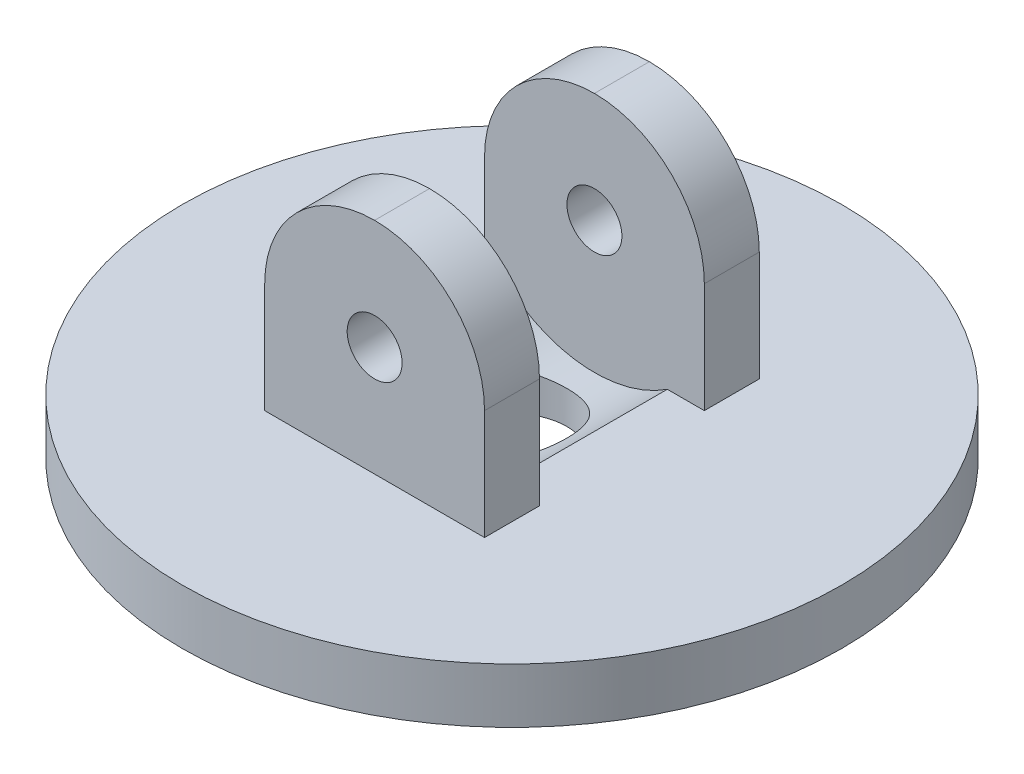
ISO-10303-21;
HEADER;
FILE_DESCRIPTION(('STEP AP214'),'2;1');
FILE_NAME('part.step','',(''),(''),'','','');
FILE_SCHEMA(('AUTOMOTIVE_DESIGN { 1 0 10303 214 1 1 1 1 }'));
ENDSEC;
DATA;
#1=APPLICATION_CONTEXT('core data for automotive mechanical design processes');
#2=APPLICATION_PROTOCOL_DEFINITION('international standard','automotive_design',2000,#1);
#3=PRODUCT_CONTEXT('',#1,'mechanical');
#4=PRODUCT('Part','Part','',(#3));
#5=PRODUCT_RELATED_PRODUCT_CATEGORY('part','',(#4));
#6=PRODUCT_DEFINITION_FORMATION('','',#4);
#7=PRODUCT_DEFINITION_CONTEXT('part definition',#1,'design');
#8=PRODUCT_DEFINITION('design','',#6,#7);
#9=PRODUCT_DEFINITION_SHAPE('','',#8);
#10=(LENGTH_UNIT() NAMED_UNIT(*) SI_UNIT(.MILLI.,.METRE.));
#11=(NAMED_UNIT(*) PLANE_ANGLE_UNIT() SI_UNIT($,.RADIAN.));
#12=(NAMED_UNIT(*) SI_UNIT($,.STERADIAN.) SOLID_ANGLE_UNIT());
#13=UNCERTAINTY_MEASURE_WITH_UNIT(LENGTH_MEASURE(1.E-05),#10,'distance_accuracy_value','');
#14=(GEOMETRIC_REPRESENTATION_CONTEXT(3) GLOBAL_UNCERTAINTY_ASSIGNED_CONTEXT((#13)) GLOBAL_UNIT_ASSIGNED_CONTEXT((#10,
#11,#12)) REPRESENTATION_CONTEXT('',''));
#15=CARTESIAN_POINT('',(0.,0.,0.));
#16=DIRECTION('',(0.,0.,1.));
#17=DIRECTION('',(1.,0.,0.));
#18=AXIS2_PLACEMENT_3D('',#15,#16,#17);
#19=CARTESIAN_POINT('',(0.,10.,0.));
#20=DIRECTION('',(0.,1.,0.));
#21=DIRECTION('',(0.,0.,1.));
#22=AXIS2_PLACEMENT_3D('',#19,#20,#21);
#23=PLANE('',#22);
#24=CARTESIAN_POINT('',(0.,10.,0.));
#25=DIRECTION('',(0.,1.,0.));
#26=DIRECTION('',(0.,0.,1.));
#27=AXIS2_PLACEMENT_3D('',#24,#25,#26);
#28=CIRCLE('',#27,60.);
#29=CARTESIAN_POINT('',(0.,10.,60.));
#30=VERTEX_POINT('',#29);
#31=EDGE_CURVE('E191',#30,#30,#28,.T.);
#32=ORIENTED_EDGE('',*,*,#31,.T.);
#33=EDGE_LOOP('',(#32));
#34=FACE_BOUND('',#33,.T.);
#35=DIRECTION('',(-1.,0.,0.));
#36=VECTOR('',#35,1.);
#37=CARTESIAN_POINT('',(-20.,10.,15.));
#38=LINE('',#37,#36);
#39=CARTESIAN_POINT('',(-13.2664991614216,10.,15.));
#40=VERTEX_POINT('',#39);
#41=CARTESIAN_POINT('',(-20.,10.,15.));
#42=VERTEX_POINT('',#41);
#43=EDGE_CURVE('E275',#40,#42,#38,.T.);
#44=ORIENTED_EDGE('',*,*,#43,.F.);
#45=DIRECTION('',(0.,0.,1.));
#46=VECTOR('',#45,1.);
#47=CARTESIAN_POINT('',(-13.2664991614216,10.,-15.));
#48=LINE('',#47,#46);
#49=CARTESIAN_POINT('',(-13.2664991614216,10.,-15.));
#50=VERTEX_POINT('',#49);
#51=EDGE_CURVE('E144',#40,#50,#48,.F.);
#52=ORIENTED_EDGE('',*,*,#51,.T.);
#53=DIRECTION('',(1.,0.,0.));
#54=VECTOR('',#53,1.);
#55=CARTESIAN_POINT('',(-20.,10.,-15.));
#56=LINE('',#55,#54);
#57=CARTESIAN_POINT('',(-20.,10.,-15.));
#58=VERTEX_POINT('',#57);
#59=EDGE_CURVE('E155',#58,#50,#56,.T.);
#60=ORIENTED_EDGE('',*,*,#59,.F.);
#61=DIRECTION('',(0.,0.,1.));
#62=VECTOR('',#61,1.);
#63=CARTESIAN_POINT('',(-20.,10.,-25.));
#64=LINE('',#63,#62);
#65=CARTESIAN_POINT('',(-20.,10.,-25.));
#66=VERTEX_POINT('',#65);
#67=EDGE_CURVE('E163',#66,#58,#64,.T.);
#68=ORIENTED_EDGE('',*,*,#67,.F.);
#69=DIRECTION('',(-1.,0.,0.));
#70=VECTOR('',#69,1.);
#71=CARTESIAN_POINT('',(-20.,10.,-25.));
#72=LINE('',#71,#70);
#73=CARTESIAN_POINT('',(20.,10.,-25.));
#74=VERTEX_POINT('',#73);
#75=EDGE_CURVE('E174',#74,#66,#72,.T.);
#76=ORIENTED_EDGE('',*,*,#75,.F.);
#77=DIRECTION('',(0.,0.,-1.));
#78=VECTOR('',#77,1.);
#79=CARTESIAN_POINT('',(20.,10.,-25.));
#80=LINE('',#79,#78);
#81=CARTESIAN_POINT('',(20.,10.,-15.));
#82=VERTEX_POINT('',#81);
#83=EDGE_CURVE('E161',#82,#74,#80,.T.);
#84=ORIENTED_EDGE('',*,*,#83,.F.);
#85=CARTESIAN_POINT('',(13.2664991614216,10.,-15.));
#86=VERTEX_POINT('',#85);
#87=EDGE_CURVE('E152',#86,#82,#56,.T.);
#88=ORIENTED_EDGE('',*,*,#87,.F.);
#89=DIRECTION('',(0.,0.,1.));
#90=VECTOR('',#89,1.);
#91=CARTESIAN_POINT('',(13.2664991614216,10.,-15.));
#92=LINE('',#91,#90);
#93=CARTESIAN_POINT('',(13.2664991614216,10.,15.));
#94=VERTEX_POINT('',#93);
#95=EDGE_CURVE('E134',#86,#94,#92,.T.);
#96=ORIENTED_EDGE('',*,*,#95,.T.);
#97=CARTESIAN_POINT('',(20.,10.,15.));
#98=VERTEX_POINT('',#97);
#99=EDGE_CURVE('E276',#98,#94,#38,.T.);
#100=ORIENTED_EDGE('',*,*,#99,.F.);
#101=DIRECTION('',(0.,0.,-1.));
#102=VECTOR('',#101,1.);
#103=CARTESIAN_POINT('',(20.,10.,25.));
#104=LINE('',#103,#102);
#105=CARTESIAN_POINT('',(20.,10.,25.));
#106=VERTEX_POINT('',#105);
#107=EDGE_CURVE('E271',#106,#98,#104,.T.);
#108=ORIENTED_EDGE('',*,*,#107,.F.);
#109=DIRECTION('',(1.,0.,0.));
#110=VECTOR('',#109,1.);
#111=CARTESIAN_POINT('',(-20.,10.,25.));
#112=LINE('',#111,#110);
#113=CARTESIAN_POINT('',(-20.,10.,25.));
#114=VERTEX_POINT('',#113);
#115=EDGE_CURVE('E267',#114,#106,#112,.T.);
#116=ORIENTED_EDGE('',*,*,#115,.F.);
#117=DIRECTION('',(0.,0.,1.));
#118=VECTOR('',#117,1.);
#119=CARTESIAN_POINT('',(-20.,10.,25.));
#120=LINE('',#119,#118);
#121=EDGE_CURVE('E235',#42,#114,#120,.T.);
#122=ORIENTED_EDGE('',*,*,#121,.F.);
#123=EDGE_LOOP('',(#44,#52,#60,#68,#76,#84,#88,#96,#100,#108,#116,#122));
#124=FACE_BOUND('',#123,.T.);
#125=ADVANCED_FACE('F38',(#34,#124),#23,.T.);
#126=CARTESIAN_POINT('',(0.,0.,0.));
#127=DIRECTION('',(0.,1.,0.));
#128=DIRECTION('',(0.,0.,1.));
#129=AXIS2_PLACEMENT_3D('',#126,#127,#128);
#130=CYLINDRICAL_SURFACE('',#129,10.);
#131=CARTESIAN_POINT('',(0.,0.,0.));
#132=DIRECTION('',(0.,1.,0.));
#133=DIRECTION('',(0.,0.,1.));
#134=AXIS2_PLACEMENT_3D('',#131,#132,#133);
#135=CIRCLE('',#134,10.);
#136=CARTESIAN_POINT('',(0.,0.,10.));
#137=VERTEX_POINT('',#136);
#138=EDGE_CURVE('E252',#137,#137,#135,.T.);
#139=ORIENTED_EDGE('',*,*,#138,.F.);
#140=EDGE_LOOP('',(#139));
#141=FACE_BOUND('',#140,.T.);
#142=CARTESIAN_POINT('',(0.,6.,10.));
#143=CARTESIAN_POINT('',(-0.267942395980707,6.00000145108515,9.9999981895495));
#144=CARTESIAN_POINT('',(-0.535975386790484,6.00449934053446,9.98921643496793));
#145=CARTESIAN_POINT('',(-1.07013305673722,6.02237885410001,9.94618964916572));
#146=CARTESIAN_POINT('',(-1.33625642052598,6.03576609977471,9.91393103611578));
#147=CARTESIAN_POINT('',(-1.8651015883341,6.07111010004662,9.82818909355407));
#148=CARTESIAN_POINT('',(-2.12781449972209,6.09308586792827,9.77465866802495));
#149=CARTESIAN_POINT('',(-2.64736249392761,6.14502886062445,9.64691914329621));
#150=CARTESIAN_POINT('',(-2.90419716793913,6.17499663942615,9.5727086105848));
#151=CARTESIAN_POINT('',(-3.40937126539884,6.24203524803507,9.4046161350003));
#152=CARTESIAN_POINT('',(-3.65773720147229,6.27908093139522,9.31080372656805));
#153=CARTESIAN_POINT('',(-4.14537925200735,6.35942232689406,9.10417315678626));
#154=CARTESIAN_POINT('',(-4.3846550422233,6.4027182617154,8.99135431825563));
#155=CARTESIAN_POINT('',(-4.85262077490821,6.49449269620126,8.74766300293879));
#156=CARTESIAN_POINT('',(-5.08131661556162,6.54296825715981,8.61680075112822));
#157=CARTESIAN_POINT('',(-5.52707949283141,6.64397873321707,8.33790160730945));
#158=CARTESIAN_POINT('',(-5.74414222952782,6.69651513202878,8.18985842788523));
#159=CARTESIAN_POINT('',(-6.3953274108156,6.86331954433258,7.70714569006144));
#160=CARTESIAN_POINT('',(-6.80822010888224,6.98247041699852,7.3449076619119));
#161=CARTESIAN_POINT('',(-7.56938865772991,7.22141220681727,6.55776712751856));
#162=CARTESIAN_POINT('',(-7.91763048634872,7.34120342702988,6.13283183709327));
#163=CARTESIAN_POINT('',(-8.39284572548998,7.51465972253198,5.44455762954869));
#164=CARTESIAN_POINT('',(-8.5463720967626,7.57271662556289,5.20028667364792));
#165=CARTESIAN_POINT('',(-8.83215198012491,7.68371511118905,4.6985466404976));
#166=CARTESIAN_POINT('',(-8.96441428989846,7.73665880565816,4.44108307993226));
#167=CARTESIAN_POINT('',(-9.20650917204407,7.83567480660773,3.91460603226709));
#168=CARTESIAN_POINT('',(-9.31634570496792,7.88174832602173,3.64559459477848));
#169=CARTESIAN_POINT('',(-9.51251468153739,7.96540333382051,3.09784789030255));
#170=CARTESIAN_POINT('',(-9.59884887528677,8.0029854544826,2.81911334909174));
#171=CARTESIAN_POINT('',(-9.74345681562225,8.06666939227215,2.26767420509551));
#172=CARTESIAN_POINT('',(-9.80288112649533,8.09323670067077,1.99532507734976));
#173=CARTESIAN_POINT('',(-9.89885422881268,8.1364351763224,1.44584100266982));
#174=CARTESIAN_POINT('',(-9.93540372731637,8.15306665069087,1.16870620393261));
#175=CARTESIAN_POINT('',(-9.98516136195053,8.17576337963049,0.612048282328569));
#176=CARTESIAN_POINT('',(-9.99838055247046,8.18183363830786,0.33252635365589));
#177=CARTESIAN_POINT('',(-10.0013392571555,8.18318947893515,-0.226660695496647));
#178=CARTESIAN_POINT('',(-9.99108000725272,8.17847562857297,-0.506325807664353));
#179=CARTESIAN_POINT('',(-9.94891108808752,8.15922069502046,-1.04196824710988));
#180=CARTESIAN_POINT('',(-9.91872846038543,8.14546386293893,-1.29811212300439));
#181=CARTESIAN_POINT('',(-9.83878936523855,8.10935938132824,-1.80680162390708));
#182=CARTESIAN_POINT('',(-9.78902616581406,8.08700877724198,-2.05934598039078));
#183=CARTESIAN_POINT('',(-9.67044051170048,8.03441835818663,-2.55900400929334));
#184=CARTESIAN_POINT('',(-9.6016226225033,8.00418043311521,-2.80611896730348));
#185=CARTESIAN_POINT('',(-9.44552692475773,7.93669912481547,-3.29356087170525));
#186=CARTESIAN_POINT('',(-9.35824188156607,7.89945299670681,-3.53388511583638));
#187=CARTESIAN_POINT('',(-9.16394698471947,7.8181743928026,-4.01121580452416));
#188=CARTESIAN_POINT('',(-9.05656430537203,7.7740167734116,-4.24804900618901));
#189=CARTESIAN_POINT('',(-8.82410320535877,7.68070593067434,-4.71195821415097));
#190=CARTESIAN_POINT('',(-8.69901712705675,7.63155054814173,-4.93902994239889));
#191=CARTESIAN_POINT('',(-8.43201215607237,7.52953961118728,-5.38220233390738));
#192=CARTESIAN_POINT('',(-8.29009159360978,7.47668368992952,-5.59830190581994));
#193=CARTESIAN_POINT('',(-7.9902700492105,7.36858427917656,-6.01848873444992));
#194=CARTESIAN_POINT('',(-7.83236817124684,7.31334065590929,-6.22257531661739));
#195=CARTESIAN_POINT('',(-7.48739534707948,7.19704445100181,-6.63453641692557));
#196=CARTESIAN_POINT('',(-7.29898640936491,7.13589642953205,-6.84126541689093));
#197=CARTESIAN_POINT('',(-6.90552786336652,7.01400243334858,-7.2382151943001));
#198=CARTESIAN_POINT('',(-6.70048352580666,6.95325633783593,-7.42844116130652));
#199=CARTESIAN_POINT('',(-6.27470806402233,6.8337108333508,-7.79142753826167));
#200=CARTESIAN_POINT('',(-6.05396724572562,6.7749126608446,-7.96417699243239));
#201=CARTESIAN_POINT('',(-5.59823981484959,6.66087285386127,-8.29085517091424));
#202=CARTESIAN_POINT('',(-5.36325897233397,6.60562979731321,-8.44479144306204));
#203=CARTESIAN_POINT('',(-4.87467792752361,6.49890474260674,-8.73614831191795));
#204=CARTESIAN_POINT('',(-4.62077079368976,6.44754092273543,-8.8730984491202));
#205=CARTESIAN_POINT('',(-4.10101925722221,6.35150168964948,-9.1249675110769));
#206=CARTESIAN_POINT('',(-3.83517454901391,6.30682644777415,-9.23988587147105));
#207=CARTESIAN_POINT('',(-3.29355055555416,6.22548687441594,-9.44650699674161));
#208=CARTESIAN_POINT('',(-3.01777576481973,6.18881897047884,-9.53822011748832));
#209=CARTESIAN_POINT('',(-2.45830619661031,6.12457361867509,-9.69748954850472));
#210=CARTESIAN_POINT('',(-2.17461202248804,6.09699548032718,-9.76504769367972));
#211=CARTESIAN_POINT('',(-1.61977734325061,6.05320893538955,-9.87172771946447));
#212=CARTESIAN_POINT('',(-1.34897802133085,6.03639163134098,-9.91237815034425));
#213=CARTESIAN_POINT('',(-0.804548170756187,6.01194181846127,-9.97134194778859));
#214=CARTESIAN_POINT('',(-0.530917761770171,6.00430892299576,-9.98965625463332));
#215=CARTESIAN_POINT('',(0.0169540328602272,5.99844280911532,-10.0037386869103));
#216=CARTESIAN_POINT('',(0.291195249905776,6.00020725693902,-9.99951241013105));
#217=CARTESIAN_POINT('',(0.838181199281528,6.01308094868715,-9.96857485020084));
#218=CARTESIAN_POINT('',(1.11092596475505,6.02418998480042,-9.94186406707527));
#219=CARTESIAN_POINT('',(1.63930826360069,6.05466237165811,-9.86814339000837));
#220=CARTESIAN_POINT('',(1.89512214440097,6.07358787630445,-9.8222087479073));
#221=CARTESIAN_POINT('',(2.40173705740469,6.11912187419512,-9.71076340176822));
#222=CARTESIAN_POINT('',(2.65253829706156,6.14573004877714,-9.64525350966983));
#223=CARTESIAN_POINT('',(3.14750041507577,6.20597983538016,-9.4952676677369));
#224=CARTESIAN_POINT('',(3.39166194748983,6.23962075177087,-9.41079359364735));
#225=CARTESIAN_POINT('',(3.87199414315334,6.31315277271617,-9.22356446385607));
#226=CARTESIAN_POINT('',(4.10816170810727,6.35304626766267,-9.12080241452646));
#227=CARTESIAN_POINT('',(4.57820933295416,6.43946482552895,-8.89438615455572));
#228=CARTESIAN_POINT('',(4.81179717415901,6.48615573044866,-8.77018792249117));
#229=CARTESIAN_POINT('',(5.26774794175134,6.58408004333587,-8.50415056860546));
#230=CARTESIAN_POINT('',(5.49010668089235,6.63531512644823,-8.36230493350176));
#231=CARTESIAN_POINT('',(6.13851398375824,6.7940483788341,-7.91172862855906));
#232=CARTESIAN_POINT('',(6.54616415415541,6.90662640154452,-7.57782750277633));
#233=CARTESIAN_POINT('',(7.33078601774137,7.14306238755664,-6.82466022091744));
#234=CARTESIAN_POINT('',(7.70348322772502,7.26715150401836,-6.40099873603727));
#235=CARTESIAN_POINT('',(8.20590761804761,7.44573593924171,-5.72211770604184));
#236=CARTESIAN_POINT('',(8.36403173748506,7.50404211396568,-5.4884227862175));
#237=CARTESIAN_POINT('',(8.66033996875701,7.61644398446383,-5.00780358757204));
#238=CARTESIAN_POINT('',(8.79853255464516,7.67054146506587,-4.76088499249968));
#239=CARTESIAN_POINT('',(9.05579366385487,7.77361671552287,-4.25149834936423));
#240=CARTESIAN_POINT('',(9.1745487005692,7.8225068118078,-3.98885419029191));
#241=CARTESIAN_POINT('',(9.38926339825983,7.91255355903525,-3.45324768988092));
#242=CARTESIAN_POINT('',(9.48523354221353,7.95371376455242,-3.18029016083085));
#243=CARTESIAN_POINT('',(9.65337406208339,8.02681669120512,-2.6260597242477));
#244=CARTESIAN_POINT('',(9.72555515375209,8.05876356166482,-2.34479062303974));
#245=CARTESIAN_POINT('',(9.84529914152277,8.11223163366638,-1.77609061250737));
#246=CARTESIAN_POINT('',(9.89286435294321,8.13375381572052,-1.48866028534446));
#247=CARTESIAN_POINT('',(9.96006579137929,8.16428769763751,-0.932427459074371));
#248=CARTESIAN_POINT('',(9.98157087726664,8.17413525190282,-0.663895216263347));
#249=CARTESIAN_POINT('',(10.0028327321041,8.1838710678816,-0.125796102540515));
#250=CARTESIAN_POINT('',(10.0025906655847,8.18375986287309,0.143770712198395));
#251=CARTESIAN_POINT('',(9.98036393979872,8.17358296274773,0.681774706919221));
#252=CARTESIAN_POINT('',(9.95838230067602,8.1635186503543,0.950212038611109));
#253=CARTESIAN_POINT('',(9.89294109580396,8.13379310943618,1.48391191230305));
#254=CARTESIAN_POINT('',(9.84948170264495,8.11413195802953,1.74917447979723));
#255=CARTESIAN_POINT('',(9.74410734970007,8.06702189864409,2.26223732772079));
#256=CARTESIAN_POINT('',(9.68315249596811,8.03998103286627,2.51027346164222));
#257=CARTESIAN_POINT('',(9.54273065392196,7.97859769500439,3.00020901410215));
#258=CARTESIAN_POINT('',(9.46325727587218,7.94425270302159,3.24210628243214));
#259=CARTESIAN_POINT('',(9.28649146145427,7.86924571154372,3.71827605543357));
#260=CARTESIAN_POINT('',(9.18919912820776,7.82858374860634,3.95254860422144));
#261=CARTESIAN_POINT('',(8.97753078967763,7.74203493568434,4.41225408875043));
#262=CARTESIAN_POINT('',(8.86315322964287,7.69614761028352,4.63768621765613));
#263=CARTESIAN_POINT('',(8.61072104068825,7.59743473200432,5.09185372728644));
#264=CARTESIAN_POINT('',(8.47165658261052,7.54435794140144,5.31997344172964));
#265=CARTESIAN_POINT('',(8.1761289977619,7.43507747672431,5.76385420355818));
#266=CARTESIAN_POINT('',(8.0196653200727,7.37887370366736,5.97961485928588));
#267=CARTESIAN_POINT('',(7.69022066745612,7.26476530625256,6.39776298356835));
#268=CARTESIAN_POINT('',(7.51723470700089,7.20686017218889,6.60014638422541));
#269=CARTESIAN_POINT('',(7.15572827054764,7.09079680842715,6.990444385111));
#270=CARTESIAN_POINT('',(6.96720766946325,7.03263857669469,7.1783588688109));
#271=CARTESIAN_POINT('',(6.56125754755266,6.91325357537494,7.55191630127629));
#272=CARTESIAN_POINT('',(6.34272209778389,6.85211354484875,7.7363875582125));
#273=CARTESIAN_POINT('',(5.89021111727877,6.73285284569504,8.08623374688171));
#274=CARTESIAN_POINT('',(5.65624068426858,6.67473119140784,8.25161493437974));
#275=CARTESIAN_POINT('',(5.17400243577387,6.56304223520821,8.56224345669264));
#276=CARTESIAN_POINT('',(4.92572437862211,6.5094782654343,8.70747610892881));
#277=CARTESIAN_POINT('',(4.41660546861321,6.40845643334078,8.97643954986754));
#278=CARTESIAN_POINT('',(4.15576564545925,6.36099807170398,9.10017209714128));
#279=CARTESIAN_POINT('',(3.6276495269143,6.27426327218203,9.32314114293535));
#280=CARTESIAN_POINT('',(3.36054883777494,6.23486546260657,9.42274595115176));
#281=CARTESIAN_POINT('',(2.81782391356667,6.16442330159726,9.59902342369105));
#282=CARTESIAN_POINT('',(2.54220054934508,6.1333780998177,9.67569842249512));
#283=CARTESIAN_POINT('',(1.98530395148749,6.08062286825473,9.80510503882957));
#284=CARTESIAN_POINT('',(1.70404780879171,6.05888808223626,9.85790017369439));
#285=CARTESIAN_POINT('',(1.13760493417306,6.02530022866351,9.93919582049617));
#286=CARTESIAN_POINT('',(0.852421244127532,6.01343990762781,9.96771416577048));
#287=CARTESIAN_POINT('',(0.472221831071567,6.00446008105422,9.98929154209191));
#288=CARTESIAN_POINT('',(0.377833617506555,6.00278845391753,9.99330612551536));
#289=CARTESIAN_POINT('',(0.188967358271803,6.00055815593586,9.99866067752467));
#290=CARTESIAN_POINT('',(0.0944893123455943,5.99999948827793,10.0000006384515));
#291=CARTESIAN_POINT('',(0.,6.,10.));
#292=B_SPLINE_CURVE_WITH_KNOTS('',3,(#142,#143,#144,#145,#146,#147,#148,#149,#150,#151,#152,
#153,#154,#155,#156,#157,#158,#159,#160,#161,#162,#163,#164,#165,#166,#167,#168,#169,#170,#171,
#172,#173,#174,#175,#176,#177,#178,#179,#180,#181,#182,#183,#184,#185,#186,#187,#188,#189,#190,
#191,#192,#193,#194,#195,#196,#197,#198,#199,#200,#201,#202,#203,#204,#205,#206,#207,#208,#209,
#210,#211,#212,#213,#214,#215,#216,#217,#218,#219,#220,#221,#222,#223,#224,#225,#226,#227,#228,
#229,#230,#231,#232,#233,#234,#235,#236,#237,#238,#239,#240,#241,#242,#243,#244,#245,#246,#247,
#248,#249,#250,#251,#252,#253,#254,#255,#256,#257,#258,#259,#260,#261,#262,#263,#264,#265,#266,
#267,#268,#269,#270,#271,#272,#273,#274,#275,#276,#277,#278,#279,#280,#281,#282,#283,#284,#285,
#286,#287,#288,#289,#290,#291),.UNSPECIFIED.,.T.,.F.,(4,2,2,2,2,2,2,2,2,2,2,2,2,2,2,2,2,2,2,2,2,
2,2,2,2,2,2,2,2,2,2,2,2,2,2,2,2,2,2,2,2,2,2,2,2,2,2,2,2,2,2,2,2,2,2,2,2,2,2,2,2,2,2,2,2,2,2,2,2,
2,2,2,2,2,4),(0.,0.803731022385501,1.60797080258543,2.41400118839126,3.22008746083233,
4.0233613974063,4.82666395992459,5.62951315773824,6.4326570928182,8.11101650109896,
9.79025664851163,10.6722031871639,11.5537838894916,12.4352087634634,13.3165679840891,
14.1555070347902,14.9944201526421,15.8329356690324,16.671407046018,17.4453474505236,
18.2195541756497,18.9935755616024,19.7679007394577,20.5583469245758,21.349136069514,
22.1400037170031,22.9309157307841,23.7888750228648,24.6465635346903,25.5047864302448,
26.3626638690609,27.2406049103281,28.1185684377023,28.9961394598893,29.8736438042196,
30.6956359784825,31.5175935482797,32.3393470004546,33.161082178414,33.9419625125544,
34.7228104619393,35.5035812117474,36.2846511854851,37.0896723910966,37.8949915993317,
39.5047252151185,41.2294998199023,42.0930357391932,42.9562034300237,43.8321527240562,
44.7076982229509,45.5828487925781,46.4579170323973,47.2655905256518,48.0732207691145,
48.8807388292805,49.688250400521,50.4579274466525,51.2278704607628,51.9978090192098,
52.7678176845946,53.5841015604466,54.4004112899784,55.2169681203578,56.0335315263713,
56.9098269079493,57.7858343097063,58.6624767569353,59.5390474666284,60.4012486954102,
61.263362113679,62.123168739397,62.9823432186909,63.2657764315139,63.549210455973),.UNSPECIFIED.);
#293=CARTESIAN_POINT('',(0.,6.,10.));
#294=VERTEX_POINT('',#293);
#295=EDGE_CURVE('E42',#294,#294,#292,.T.);
#296=ORIENTED_EDGE('',*,*,#295,.F.);
#297=EDGE_LOOP('',(#296));
#298=FACE_BOUND('',#297,.T.);
#299=ADVANCED_FACE('F317',(#141,#298),#130,.F.);
#300=CARTESIAN_POINT('',(0.,10.,0.));
#301=DIRECTION('',(0.,-1.,0.));
#302=DIRECTION('',(0.,0.,-1.));
#303=AXIS2_PLACEMENT_3D('',#300,#301,#302);
#304=CYLINDRICAL_SURFACE('',#303,60.);
#305=ORIENTED_EDGE('',*,*,#31,.F.);
#306=EDGE_LOOP('',(#305));
#307=FACE_BOUND('',#306,.T.);
#308=CARTESIAN_POINT('',(0.,0.,0.));
#309=DIRECTION('',(0.,1.,0.));
#310=DIRECTION('',(0.,0.,1.));
#311=AXIS2_PLACEMENT_3D('',#308,#309,#310);
#312=CIRCLE('',#311,60.);
#313=CARTESIAN_POINT('',(0.,0.,60.));
#314=VERTEX_POINT('',#313);
#315=EDGE_CURVE('E190',#314,#314,#312,.T.);
#316=ORIENTED_EDGE('',*,*,#315,.T.);
#317=EDGE_LOOP('',(#316));
#318=FACE_BOUND('',#317,.T.);
#319=ADVANCED_FACE('F319',(#307,#318),#304,.T.);
#320=CARTESIAN_POINT('',(0.,0.,0.));
#321=DIRECTION('',(0.,1.,0.));
#322=DIRECTION('',(0.,0.,1.));
#323=AXIS2_PLACEMENT_3D('',#320,#321,#322);
#324=PLANE('',#323);
#325=ORIENTED_EDGE('',*,*,#138,.T.);
#326=EDGE_LOOP('',(#325));
#327=FACE_BOUND('',#326,.T.);
#328=ORIENTED_EDGE('',*,*,#315,.F.);
#329=EDGE_LOOP('',(#328));
#330=FACE_BOUND('',#329,.T.);
#331=ADVANCED_FACE('F326',(#327,#330),#324,.F.);
#332=CARTESIAN_POINT('',(-20.,50.,-25.));
#333=DIRECTION('',(1.,0.,0.));
#334=DIRECTION('',(0.,0.,-1.));
#335=AXIS2_PLACEMENT_3D('',#332,#333,#334);
#336=PLANE('',#335);
#337=DIRECTION('',(0.,-1.,0.));
#338=VECTOR('',#337,1.);
#339=CARTESIAN_POINT('',(-20.,50.,-15.));
#340=LINE('',#339,#338);
#341=CARTESIAN_POINT('',(-20.,30.,-15.));
#342=VERTEX_POINT('',#341);
#343=EDGE_CURVE('E187',#342,#58,#340,.T.);
#344=ORIENTED_EDGE('',*,*,#343,.F.);
#345=DIRECTION('',(0.,0.,1.));
#346=VECTOR('',#345,1.);
#347=CARTESIAN_POINT('',(-20.,30.,-25.));
#348=LINE('',#347,#346);
#349=CARTESIAN_POINT('',(-20.,30.,-25.));
#350=VERTEX_POINT('',#349);
#351=EDGE_CURVE('E11',#342,#350,#348,.F.);
#352=ORIENTED_EDGE('',*,*,#351,.T.);
#353=DIRECTION('',(0.,-1.,0.));
#354=VECTOR('',#353,1.);
#355=CARTESIAN_POINT('',(-20.,50.,-25.));
#356=LINE('',#355,#354);
#357=EDGE_CURVE('E178',#350,#66,#356,.T.);
#358=ORIENTED_EDGE('',*,*,#357,.T.);
#359=ORIENTED_EDGE('',*,*,#67,.T.);
#360=EDGE_LOOP('',(#344,#352,#358,#359));
#361=FACE_BOUND('',#360,.T.);
#362=ADVANCED_FACE('F359',(#361),#336,.F.);
#363=CARTESIAN_POINT('',(-20.,50.,-15.));
#364=DIRECTION('',(0.,0.,-1.));
#365=DIRECTION('',(-1.,0.,0.));
#366=AXIS2_PLACEMENT_3D('',#363,#364,#365);
#367=PLANE('',#366);
#368=ORIENTED_EDGE('',*,*,#87,.T.);
#369=DIRECTION('',(0.,-1.,0.));
#370=VECTOR('',#369,1.);
#371=CARTESIAN_POINT('',(20.,50.,-15.));
#372=LINE('',#371,#370);
#373=CARTESIAN_POINT('',(20.,30.,-15.));
#374=VERTEX_POINT('',#373);
#375=EDGE_CURVE('E184',#374,#82,#372,.T.);
#376=ORIENTED_EDGE('',*,*,#375,.F.);
#377=CARTESIAN_POINT('',(0.,30.,-15.));
#378=DIRECTION('',(0.,0.,-1.));
#379=DIRECTION('',(-1.,0.,0.));
#380=AXIS2_PLACEMENT_3D('',#377,#378,#379);
#381=CIRCLE('',#380,20.);
#382=CARTESIAN_POINT('',(0.,50.,-15.));
#383=VERTEX_POINT('',#382);
#384=EDGE_CURVE('E211',#374,#383,#381,.F.);
#385=ORIENTED_EDGE('',*,*,#384,.T.);
#386=CARTESIAN_POINT('',(0.,30.,-15.));
#387=DIRECTION('',(0.,0.,-1.));
#388=DIRECTION('',(-1.,0.,0.));
#389=AXIS2_PLACEMENT_3D('',#386,#387,#388);
#390=CIRCLE('',#389,20.);
#391=EDGE_CURVE('E208',#383,#342,#390,.F.);
#392=ORIENTED_EDGE('',*,*,#391,.T.);
#393=ORIENTED_EDGE('',*,*,#343,.T.);
#394=ORIENTED_EDGE('',*,*,#59,.T.);
#395=CARTESIAN_POINT('',(0.,30.,-15.));
#396=DIRECTION('',(0.,0.,-1.));
#397=DIRECTION('',(-1.,0.,0.));
#398=AXIS2_PLACEMENT_3D('',#395,#396,#397);
#399=CIRCLE('',#398,24.);
#400=EDGE_CURVE('E138',#86,#50,#399,.T.);
#401=ORIENTED_EDGE('',*,*,#400,.F.);
#402=EDGE_LOOP('',(#368,#376,#385,#392,#393,#394,#401));
#403=FACE_BOUND('',#402,.T.);
#404=CARTESIAN_POINT('',(0.,30.,-15.));
#405=DIRECTION('',(0.,0.,-1.));
#406=DIRECTION('',(-1.,0.,0.));
#407=AXIS2_PLACEMENT_3D('',#404,#405,#406);
#408=CIRCLE('',#407,5.);
#409=CARTESIAN_POINT('',(-5.,30.,-15.));
#410=VERTEX_POINT('',#409);
#411=EDGE_CURVE('E239',#410,#410,#408,.T.);
#412=ORIENTED_EDGE('',*,*,#411,.T.);
#413=EDGE_LOOP('',(#412));
#414=FACE_BOUND('',#413,.T.);
#415=ADVANCED_FACE('F149',(#403,#414),#367,.F.);
#416=CARTESIAN_POINT('',(20.,50.,-25.));
#417=DIRECTION('',(-1.,0.,0.));
#418=DIRECTION('',(0.,0.,1.));
#419=AXIS2_PLACEMENT_3D('',#416,#417,#418);
#420=PLANE('',#419);
#421=DIRECTION('',(0.,-1.,0.));
#422=VECTOR('',#421,1.);
#423=CARTESIAN_POINT('',(20.,50.,-25.));
#424=LINE('',#423,#422);
#425=CARTESIAN_POINT('',(20.,30.,-25.));
#426=VERTEX_POINT('',#425);
#427=EDGE_CURVE('E181',#426,#74,#424,.T.);
#428=ORIENTED_EDGE('',*,*,#427,.F.);
#429=DIRECTION('',(0.,0.,-1.));
#430=VECTOR('',#429,1.);
#431=CARTESIAN_POINT('',(20.,30.,-15.));
#432=LINE('',#431,#430);
#433=EDGE_CURVE('E204',#426,#374,#432,.F.);
#434=ORIENTED_EDGE('',*,*,#433,.T.);
#435=ORIENTED_EDGE('',*,*,#375,.T.);
#436=ORIENTED_EDGE('',*,*,#83,.T.);
#437=EDGE_LOOP('',(#428,#434,#435,#436));
#438=FACE_BOUND('',#437,.T.);
#439=ADVANCED_FACE('F352',(#438),#420,.F.);
#440=CARTESIAN_POINT('',(-20.,50.,-25.));
#441=DIRECTION('',(0.,0.,1.));
#442=DIRECTION('',(1.,0.,0.));
#443=AXIS2_PLACEMENT_3D('',#440,#441,#442);
#444=PLANE('',#443);
#445=CARTESIAN_POINT('',(0.,30.,-25.));
#446=DIRECTION('',(0.,0.,-1.));
#447=DIRECTION('',(-1.,0.,0.));
#448=AXIS2_PLACEMENT_3D('',#445,#446,#447);
#449=CIRCLE('',#448,5.);
#450=CARTESIAN_POINT('',(-5.,30.,-25.));
#451=VERTEX_POINT('',#450);
#452=EDGE_CURVE('E244',#451,#451,#449,.T.);
#453=ORIENTED_EDGE('',*,*,#452,.F.);
#454=EDGE_LOOP('',(#453));
#455=FACE_BOUND('',#454,.T.);
#456=CARTESIAN_POINT('',(0.,30.,-25.));
#457=DIRECTION('',(0.,0.,1.));
#458=DIRECTION('',(1.,0.,0.));
#459=AXIS2_PLACEMENT_3D('',#456,#457,#458);
#460=CIRCLE('',#459,20.);
#461=CARTESIAN_POINT('',(0.,50.,-25.));
#462=VERTEX_POINT('',#461);
#463=EDGE_CURVE('E195',#350,#462,#460,.F.);
#464=ORIENTED_EDGE('',*,*,#463,.T.);
#465=CARTESIAN_POINT('',(0.,30.,-25.));
#466=DIRECTION('',(0.,0.,1.));
#467=DIRECTION('',(1.,0.,0.));
#468=AXIS2_PLACEMENT_3D('',#465,#466,#467);
#469=CIRCLE('',#468,20.);
#470=EDGE_CURVE('E201',#462,#426,#469,.F.);
#471=ORIENTED_EDGE('',*,*,#470,.T.);
#472=ORIENTED_EDGE('',*,*,#427,.T.);
#473=ORIENTED_EDGE('',*,*,#75,.T.);
#474=ORIENTED_EDGE('',*,*,#357,.F.);
#475=EDGE_LOOP('',(#464,#471,#472,#473,#474));
#476=FACE_BOUND('',#475,.T.);
#477=ADVANCED_FACE('F349',(#455,#476),#444,.F.);
#478=CARTESIAN_POINT('',(-20.,50.,25.));
#479=DIRECTION('',(1.,0.,0.));
#480=DIRECTION('',(0.,0.,-1.));
#481=AXIS2_PLACEMENT_3D('',#478,#479,#480);
#482=PLANE('',#481);
#483=DIRECTION('',(0.,-1.,0.));
#484=VECTOR('',#483,1.);
#485=CARTESIAN_POINT('',(-20.,50.,25.));
#486=LINE('',#485,#484);
#487=CARTESIAN_POINT('',(-20.,30.,25.));
#488=VERTEX_POINT('',#487);
#489=EDGE_CURVE('E168',#488,#114,#486,.T.);
#490=ORIENTED_EDGE('',*,*,#489,.F.);
#491=DIRECTION('',(0.,0.,1.));
#492=VECTOR('',#491,1.);
#493=CARTESIAN_POINT('',(-20.,30.,25.));
#494=LINE('',#493,#492);
#495=CARTESIAN_POINT('',(-20.,30.,15.));
#496=VERTEX_POINT('',#495);
#497=EDGE_CURVE('E53',#488,#496,#494,.F.);
#498=ORIENTED_EDGE('',*,*,#497,.T.);
#499=DIRECTION('',(0.,-1.,0.));
#500=VECTOR('',#499,1.);
#501=CARTESIAN_POINT('',(-20.,50.,15.));
#502=LINE('',#501,#500);
#503=EDGE_CURVE('E279',#496,#42,#502,.T.);
#504=ORIENTED_EDGE('',*,*,#503,.T.);
#505=ORIENTED_EDGE('',*,*,#121,.T.);
#506=EDGE_LOOP('',(#490,#498,#504,#505));
#507=FACE_BOUND('',#506,.T.);
#508=ADVANCED_FACE('F295',(#507),#482,.F.);
#509=CARTESIAN_POINT('',(-20.,50.,25.));
#510=DIRECTION('',(0.,0.,-1.));
#511=DIRECTION('',(-1.,0.,0.));
#512=AXIS2_PLACEMENT_3D('',#509,#510,#511);
#513=PLANE('',#512);
#514=CARTESIAN_POINT('',(0.,30.,25.));
#515=DIRECTION('',(0.,0.,-1.));
#516=DIRECTION('',(-1.,0.,0.));
#517=AXIS2_PLACEMENT_3D('',#514,#515,#516);
#518=CIRCLE('',#517,5.);
#519=CARTESIAN_POINT('',(-5.,30.,25.));
#520=VERTEX_POINT('',#519);
#521=EDGE_CURVE('E243',#520,#520,#518,.T.);
#522=ORIENTED_EDGE('',*,*,#521,.T.);
#523=EDGE_LOOP('',(#522));
#524=FACE_BOUND('',#523,.T.);
#525=DIRECTION('',(0.,-1.,0.));
#526=VECTOR('',#525,1.);
#527=CARTESIAN_POINT('',(20.,50.,25.));
#528=LINE('',#527,#526);
#529=CARTESIAN_POINT('',(20.,30.,25.));
#530=VERTEX_POINT('',#529);
#531=EDGE_CURVE('E285',#530,#106,#528,.T.);
#532=ORIENTED_EDGE('',*,*,#531,.F.);
#533=CARTESIAN_POINT('',(0.,30.,25.));
#534=DIRECTION('',(0.,0.,-1.));
#535=DIRECTION('',(-1.,0.,0.));
#536=AXIS2_PLACEMENT_3D('',#533,#534,#535);
#537=CIRCLE('',#536,20.);
#538=CARTESIAN_POINT('',(0.,50.,25.));
#539=VERTEX_POINT('',#538);
#540=EDGE_CURVE('E226',#530,#539,#537,.F.);
#541=ORIENTED_EDGE('',*,*,#540,.T.);
#542=CARTESIAN_POINT('',(0.,30.,25.));
#543=DIRECTION('',(0.,0.,-1.));
#544=DIRECTION('',(-1.,0.,0.));
#545=AXIS2_PLACEMENT_3D('',#542,#543,#544);
#546=CIRCLE('',#545,20.);
#547=EDGE_CURVE('E69',#539,#488,#546,.F.);
#548=ORIENTED_EDGE('',*,*,#547,.T.);
#549=ORIENTED_EDGE('',*,*,#489,.T.);
#550=ORIENTED_EDGE('',*,*,#115,.T.);
#551=EDGE_LOOP('',(#532,#541,#548,#549,#550));
#552=FACE_BOUND('',#551,.T.);
#553=ADVANCED_FACE('F289',(#524,#552),#513,.F.);
#554=CARTESIAN_POINT('',(20.,50.,25.));
#555=DIRECTION('',(-1.,0.,0.));
#556=DIRECTION('',(0.,0.,1.));
#557=AXIS2_PLACEMENT_3D('',#554,#555,#556);
#558=PLANE('',#557);
#559=DIRECTION('',(0.,-1.,0.));
#560=VECTOR('',#559,1.);
#561=CARTESIAN_POINT('',(20.,50.,15.));
#562=LINE('',#561,#560);
#563=CARTESIAN_POINT('',(20.,30.,15.));
#564=VERTEX_POINT('',#563);
#565=EDGE_CURVE('E282',#564,#98,#562,.T.);
#566=ORIENTED_EDGE('',*,*,#565,.F.);
#567=DIRECTION('',(0.,0.,-1.));
#568=VECTOR('',#567,1.);
#569=CARTESIAN_POINT('',(20.,30.,25.));
#570=LINE('',#569,#568);
#571=EDGE_CURVE('E220',#564,#530,#570,.F.);
#572=ORIENTED_EDGE('',*,*,#571,.T.);
#573=ORIENTED_EDGE('',*,*,#531,.T.);
#574=ORIENTED_EDGE('',*,*,#107,.T.);
#575=EDGE_LOOP('',(#566,#572,#573,#574));
#576=FACE_BOUND('',#575,.T.);
#577=ADVANCED_FACE('F299',(#576),#558,.F.);
#578=CARTESIAN_POINT('',(-20.,50.,15.));
#579=DIRECTION('',(0.,0.,1.));
#580=DIRECTION('',(1.,0.,0.));
#581=AXIS2_PLACEMENT_3D('',#578,#579,#580);
#582=PLANE('',#581);
#583=ORIENTED_EDGE('',*,*,#43,.T.);
#584=ORIENTED_EDGE('',*,*,#503,.F.);
#585=CARTESIAN_POINT('',(0.,30.,15.));
#586=DIRECTION('',(0.,0.,1.));
#587=DIRECTION('',(1.,0.,0.));
#588=AXIS2_PLACEMENT_3D('',#585,#586,#587);
#589=CIRCLE('',#588,20.);
#590=CARTESIAN_POINT('',(0.,50.,15.));
#591=VERTEX_POINT('',#590);
#592=EDGE_CURVE('E214',#496,#591,#589,.F.);
#593=ORIENTED_EDGE('',*,*,#592,.T.);
#594=CARTESIAN_POINT('',(0.,30.,15.));
#595=DIRECTION('',(0.,0.,1.));
#596=DIRECTION('',(1.,0.,0.));
#597=AXIS2_PLACEMENT_3D('',#594,#595,#596);
#598=CIRCLE('',#597,20.);
#599=EDGE_CURVE('E217',#591,#564,#598,.F.);
#600=ORIENTED_EDGE('',*,*,#599,.T.);
#601=ORIENTED_EDGE('',*,*,#565,.T.);
#602=ORIENTED_EDGE('',*,*,#99,.T.);
#603=CARTESIAN_POINT('',(0.,30.,15.));
#604=DIRECTION('',(0.,0.,-1.));
#605=DIRECTION('',(-1.,0.,0.));
#606=AXIS2_PLACEMENT_3D('',#603,#604,#605);
#607=CIRCLE('',#606,24.);
#608=EDGE_CURVE('E61',#94,#40,#607,.T.);
#609=ORIENTED_EDGE('',*,*,#608,.T.);
#610=EDGE_LOOP('',(#583,#584,#593,#600,#601,#602,#609));
#611=FACE_BOUND('',#610,.T.);
#612=CARTESIAN_POINT('',(0.,30.,15.));
#613=DIRECTION('',(0.,0.,1.));
#614=DIRECTION('',(1.,0.,0.));
#615=AXIS2_PLACEMENT_3D('',#612,#613,#614);
#616=CIRCLE('',#615,5.);
#617=CARTESIAN_POINT('',(5.,30.,15.));
#618=VERTEX_POINT('',#617);
#619=EDGE_CURVE('E240',#618,#618,#616,.T.);
#620=ORIENTED_EDGE('',*,*,#619,.T.);
#621=EDGE_LOOP('',(#620));
#622=FACE_BOUND('',#621,.T.);
#623=ADVANCED_FACE('F307',(#611,#622),#582,.F.);
#624=CARTESIAN_POINT('',(0.,30.,0.));
#625=DIRECTION('',(0.,0.,-1.));
#626=DIRECTION('',(-1.,0.,0.));
#627=AXIS2_PLACEMENT_3D('',#624,#625,#626);
#628=CYLINDRICAL_SURFACE('',#627,20.);
#629=ORIENTED_EDGE('',*,*,#351,.F.);
#630=ORIENTED_EDGE('',*,*,#391,.F.);
#631=DIRECTION('',(0.,0.,1.));
#632=VECTOR('',#631,1.);
#633=CARTESIAN_POINT('',(0.,50.,-15.));
#634=LINE('',#633,#632);
#635=EDGE_CURVE('E231',#462,#383,#634,.T.);
#636=ORIENTED_EDGE('',*,*,#635,.F.);
#637=ORIENTED_EDGE('',*,*,#463,.F.);
#638=EDGE_LOOP('',(#629,#630,#636,#637));
#639=FACE_BOUND('',#638,.T.);
#640=ADVANCED_FACE('F341',(#639),#628,.T.);
#641=CARTESIAN_POINT('',(0.,30.,0.));
#642=DIRECTION('',(0.,0.,1.));
#643=DIRECTION('',(1.,0.,0.));
#644=AXIS2_PLACEMENT_3D('',#641,#642,#643);
#645=CYLINDRICAL_SURFACE('',#644,20.);
#646=ORIENTED_EDGE('',*,*,#384,.F.);
#647=ORIENTED_EDGE('',*,*,#433,.F.);
#648=ORIENTED_EDGE('',*,*,#470,.F.);
#649=ORIENTED_EDGE('',*,*,#635,.T.);
#650=EDGE_LOOP('',(#646,#647,#648,#649));
#651=FACE_BOUND('',#650,.T.);
#652=ADVANCED_FACE('F365',(#651),#645,.T.);
#653=CARTESIAN_POINT('',(0.,30.,0.));
#654=DIRECTION('',(0.,0.,1.));
#655=DIRECTION('',(1.,0.,0.));
#656=AXIS2_PLACEMENT_3D('',#653,#654,#655);
#657=CYLINDRICAL_SURFACE('',#656,20.);
#658=ORIENTED_EDGE('',*,*,#497,.F.);
#659=ORIENTED_EDGE('',*,*,#547,.F.);
#660=DIRECTION('',(0.,0.,1.));
#661=VECTOR('',#660,1.);
#662=CARTESIAN_POINT('',(0.,50.,0.));
#663=LINE('',#662,#661);
#664=EDGE_CURVE('E236',#591,#539,#663,.T.);
#665=ORIENTED_EDGE('',*,*,#664,.F.);
#666=ORIENTED_EDGE('',*,*,#592,.F.);
#667=EDGE_LOOP('',(#658,#659,#665,#666));
#668=FACE_BOUND('',#667,.T.);
#669=ADVANCED_FACE('F40',(#668),#657,.T.);
#670=CARTESIAN_POINT('',(0.,30.,0.));
#671=DIRECTION('',(0.,0.,-1.));
#672=DIRECTION('',(-1.,0.,0.));
#673=AXIS2_PLACEMENT_3D('',#670,#671,#672);
#674=CYLINDRICAL_SURFACE('',#673,20.);
#675=ORIENTED_EDGE('',*,*,#540,.F.);
#676=ORIENTED_EDGE('',*,*,#571,.F.);
#677=ORIENTED_EDGE('',*,*,#599,.F.);
#678=ORIENTED_EDGE('',*,*,#664,.T.);
#679=EDGE_LOOP('',(#675,#676,#677,#678));
#680=FACE_BOUND('',#679,.T.);
#681=ADVANCED_FACE('F306',(#680),#674,.T.);
#682=CARTESIAN_POINT('',(0.,30.,60.));
#683=DIRECTION('',(0.,0.,-1.));
#684=DIRECTION('',(-1.,0.,0.));
#685=AXIS2_PLACEMENT_3D('',#682,#683,#684);
#686=CYLINDRICAL_SURFACE('',#685,5.);
#687=ORIENTED_EDGE('',*,*,#619,.F.);
#688=EDGE_LOOP('',(#687));
#689=FACE_BOUND('',#688,.T.);
#690=ORIENTED_EDGE('',*,*,#521,.F.);
#691=EDGE_LOOP('',(#690));
#692=FACE_BOUND('',#691,.T.);
#693=ADVANCED_FACE('F338',(#689,#692),#686,.F.);
#694=ORIENTED_EDGE('',*,*,#452,.T.);
#695=EDGE_LOOP('',(#694));
#696=FACE_BOUND('',#695,.T.);
#697=ORIENTED_EDGE('',*,*,#411,.F.);
#698=EDGE_LOOP('',(#697));
#699=FACE_BOUND('',#698,.T.);
#700=ADVANCED_FACE('F335',(#696,#699),#686,.F.);
#701=CARTESIAN_POINT('',(0.,30.,-15.));
#702=DIRECTION('',(0.,0.,1.));
#703=DIRECTION('',(1.,0.,0.));
#704=AXIS2_PLACEMENT_3D('',#701,#702,#703);
#705=CYLINDRICAL_SURFACE('',#704,24.);
#706=ORIENTED_EDGE('',*,*,#608,.F.);
#707=ORIENTED_EDGE('',*,*,#95,.F.);
#708=ORIENTED_EDGE('',*,*,#400,.T.);
#709=ORIENTED_EDGE('',*,*,#51,.F.);
#710=EDGE_LOOP('',(#706,#707,#708,#709));
#711=FACE_BOUND('',#710,.T.);
#712=ORIENTED_EDGE('',*,*,#295,.T.);
#713=EDGE_LOOP('',(#712));
#714=FACE_BOUND('',#713,.T.);
#715=ADVANCED_FACE('F136',(#711,#714),#705,.F.);
#716=CLOSED_SHELL('',(#125,#299,#319,#331,#362,#415,#439,#477,#508,#553,#577,#623,#640,#652,
#669,#681,#693,#700,#715));
#717=MANIFOLD_SOLID_BREP('B2',#716);
#718=ADVANCED_BREP_SHAPE_REPRESENTATION('',(#18,#717),#14);
#719=SHAPE_DEFINITION_REPRESENTATION(#9,#718);
ENDSEC;
END-ISO-10303-21;
